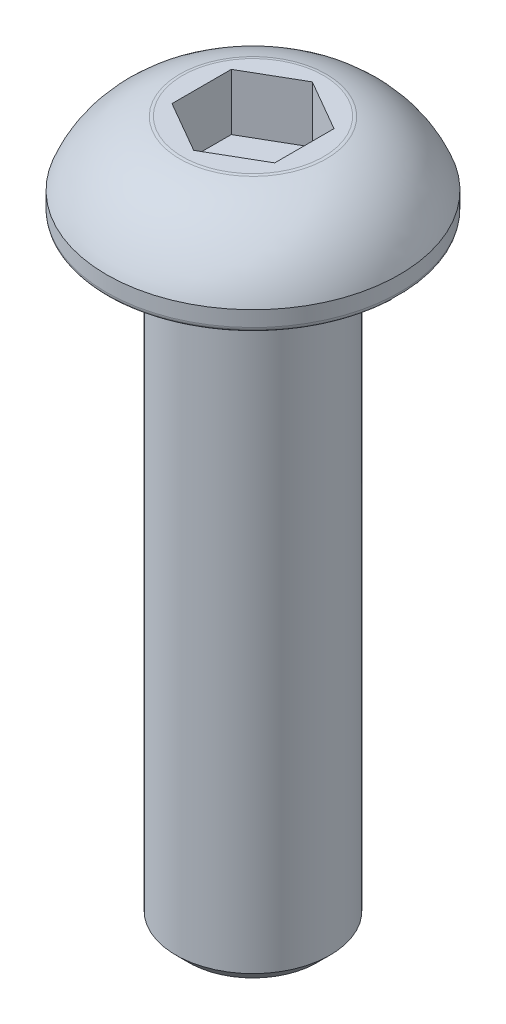
ISO-10303-21;
HEADER;
FILE_DESCRIPTION(('STEP AP214'),'2;1');
FILE_NAME('part.step','',(''),(''),'','','');
FILE_SCHEMA(('AUTOMOTIVE_DESIGN { 1 0 10303 214 1 1 1 1 }'));
ENDSEC;
DATA;
#1=APPLICATION_CONTEXT('core data for automotive mechanical design processes');
#2=APPLICATION_PROTOCOL_DEFINITION('international standard','automotive_design',2000,#1);
#3=PRODUCT_CONTEXT('',#1,'mechanical');
#4=PRODUCT('Part','Part','',(#3));
#5=PRODUCT_RELATED_PRODUCT_CATEGORY('part','',(#4));
#6=PRODUCT_DEFINITION_FORMATION('','',#4);
#7=PRODUCT_DEFINITION_CONTEXT('part definition',#1,'design');
#8=PRODUCT_DEFINITION('design','',#6,#7);
#9=PRODUCT_DEFINITION_SHAPE('','',#8);
#10=(LENGTH_UNIT() NAMED_UNIT(*) SI_UNIT(.MILLI.,.METRE.));
#11=(NAMED_UNIT(*) PLANE_ANGLE_UNIT() SI_UNIT($,.RADIAN.));
#12=(NAMED_UNIT(*) SI_UNIT($,.STERADIAN.) SOLID_ANGLE_UNIT());
#13=UNCERTAINTY_MEASURE_WITH_UNIT(LENGTH_MEASURE(1.E-05),#10,'distance_accuracy_value','');
#14=(GEOMETRIC_REPRESENTATION_CONTEXT(3) GLOBAL_UNCERTAINTY_ASSIGNED_CONTEXT((#13)) GLOBAL_UNIT_ASSIGNED_CONTEXT((#10,
#11,#12)) REPRESENTATION_CONTEXT('',''));
#15=CARTESIAN_POINT('',(0.,0.,0.));
#16=DIRECTION('',(0.,0.,1.));
#17=DIRECTION('',(1.,0.,0.));
#18=AXIS2_PLACEMENT_3D('',#15,#16,#17);
#19=CARTESIAN_POINT('',(0.,0.0999999999999998,0.));
#20=DIRECTION('',(0.,-1.,0.));
#21=DIRECTION('',(0.,0.,-1.));
#22=AXIS2_PLACEMENT_3D('',#19,#20,#21);
#23=TOROIDAL_SURFACE('',#22,2.75,0.0999999999999999);
#24=CARTESIAN_POINT('',(0.,0.,0.));
#25=DIRECTION('',(0.,-1.,0.));
#26=DIRECTION('',(0.,0.,-1.));
#27=AXIS2_PLACEMENT_3D('',#24,#25,#26);
#28=CIRCLE('',#27,2.75);
#29=CARTESIAN_POINT('',(0.,0.,-2.75));
#30=VERTEX_POINT('',#29);
#31=EDGE_CURVE('E136',#30,#30,#28,.T.);
#32=ORIENTED_EDGE('',*,*,#31,.F.);
#33=EDGE_LOOP('',(#32));
#34=FACE_BOUND('',#33,.T.);
#35=CARTESIAN_POINT('',(0.,0.100000000000001,0.));
#36=DIRECTION('',(0.,-1.,0.));
#37=DIRECTION('',(0.,0.,-1.));
#38=AXIS2_PLACEMENT_3D('',#35,#36,#37);
#39=CIRCLE('',#38,2.85);
#40=CARTESIAN_POINT('',(0.,0.100000000000001,-2.85));
#41=VERTEX_POINT('',#40);
#42=EDGE_CURVE('E11',#41,#41,#39,.T.);
#43=ORIENTED_EDGE('',*,*,#42,.T.);
#44=EDGE_LOOP('',(#43));
#45=FACE_BOUND('',#44,.T.);
#46=ADVANCED_FACE('F35',(#34,#45),#23,.T.);
#47=CARTESIAN_POINT('',(0.,-12.,0.));
#48=DIRECTION('',(0.,-1.,0.));
#49=DIRECTION('',(0.,0.,-1.));
#50=AXIS2_PLACEMENT_3D('',#47,#48,#49);
#51=CYLINDRICAL_SURFACE('',#50,2.85);
#52=ORIENTED_EDGE('',*,*,#42,.F.);
#53=EDGE_LOOP('',(#52));
#54=FACE_BOUND('',#53,.T.);
#55=CARTESIAN_POINT('',(0.,0.399999999999999,0.));
#56=DIRECTION('',(0.,-1.,0.));
#57=DIRECTION('',(0.,0.,-1.));
#58=AXIS2_PLACEMENT_3D('',#55,#56,#57);
#59=CIRCLE('',#58,2.85);
#60=CARTESIAN_POINT('',(0.,0.399999999999999,-2.85));
#61=VERTEX_POINT('',#60);
#62=EDGE_CURVE('E42',#61,#61,#59,.T.);
#63=ORIENTED_EDGE('',*,*,#62,.T.);
#64=EDGE_LOOP('',(#63));
#65=FACE_BOUND('',#64,.T.);
#66=ADVANCED_FACE('F164',(#54,#65),#51,.T.);
#67=CARTESIAN_POINT('',(0.,-0.305058043743636,0.));
#68=DIRECTION('',(0.,-1.,0.));
#69=DIRECTION('',(0.,0.,-1.));
#70=AXIS2_PLACEMENT_3D('',#67,#68,#69);
#71=DEGENERATE_TOROIDAL_SURFACE('',#70,0.978398238152038,2.,.T.);
#72=ORIENTED_EDGE('',*,*,#62,.F.);
#73=EDGE_LOOP('',(#72));
#74=FACE_BOUND('',#73,.T.);
#75=CARTESIAN_POINT('',(0.,1.6435797205348,0.));
#76=DIRECTION('',(0.,-1.,0.));
#77=DIRECTION('',(0.,0.,-1.));
#78=AXIS2_PLACEMENT_3D('',#75,#76,#77);
#79=CIRCLE('',#78,1.42874350972477);
#80=CARTESIAN_POINT('',(0.,1.6435797205348,-1.42874350972477));
#81=VERTEX_POINT('',#80);
#82=EDGE_CURVE('E159',#81,#81,#79,.T.);
#83=ORIENTED_EDGE('',*,*,#82,.T.);
#84=EDGE_LOOP('',(#83));
#85=FACE_BOUND('',#84,.T.);
#86=ADVANCED_FACE('F166',(#74,#85),#71,.T.);
#87=CARTESIAN_POINT('',(0.,1.4,0.));
#88=DIRECTION('',(0.,-1.,0.));
#89=DIRECTION('',(0.,0.,-1.));
#90=AXIS2_PLACEMENT_3D('',#87,#88,#89);
#91=TOROIDAL_SURFACE('',#90,1.37245035077818,0.25);
#92=ORIENTED_EDGE('',*,*,#82,.F.);
#93=EDGE_LOOP('',(#92));
#94=FACE_BOUND('',#93,.T.);
#95=CARTESIAN_POINT('',(0.,1.65,0.));
#96=DIRECTION('',(0.,-1.,0.));
#97=DIRECTION('',(0.,0.,-1.));
#98=AXIS2_PLACEMENT_3D('',#95,#96,#97);
#99=CIRCLE('',#98,1.37245035077818);
#100=CARTESIAN_POINT('',(0.,1.65,-1.37245035077818));
#101=VERTEX_POINT('',#100);
#102=EDGE_CURVE('E156',#101,#101,#99,.T.);
#103=ORIENTED_EDGE('',*,*,#102,.T.);
#104=EDGE_LOOP('',(#103));
#105=FACE_BOUND('',#104,.T.);
#106=ADVANCED_FACE('F169',(#94,#105),#91,.T.);
#107=CARTESIAN_POINT('',(-1.37245035077818,1.65,0.));
#108=DIRECTION('',(0.,-1.,0.));
#109=DIRECTION('',(0.,0.,-1.));
#110=AXIS2_PLACEMENT_3D('',#107,#108,#109);
#111=PLANE('',#110);
#112=DIRECTION('',(0.,0.,1.));
#113=VECTOR('',#112,1.);
#114=CARTESIAN_POINT('',(-1.,1.65,-0.577350269189625));
#115=LINE('',#114,#113);
#116=CARTESIAN_POINT('',(-1.,1.65,-0.577350269189625));
#117=VERTEX_POINT('',#116);
#118=CARTESIAN_POINT('',(-1.,1.65,0.577350269189626));
#119=VERTEX_POINT('',#118);
#120=EDGE_CURVE('E123',#117,#119,#115,.T.);
#121=ORIENTED_EDGE('',*,*,#120,.F.);
#122=DIRECTION('',(-0.866025403784438,0.,0.5));
#123=VECTOR('',#122,1.);
#124=CARTESIAN_POINT('',(0.,1.65,-1.15470053837925));
#125=LINE('',#124,#123);
#126=CARTESIAN_POINT('',(0.,1.65,-1.15470053837925));
#127=VERTEX_POINT('',#126);
#128=EDGE_CURVE('E49',#127,#117,#125,.T.);
#129=ORIENTED_EDGE('',*,*,#128,.F.);
#130=DIRECTION('',(-0.866025403784439,0.,-0.5));
#131=VECTOR('',#130,1.);
#132=CARTESIAN_POINT('',(1.,1.65,-0.577350269189626));
#133=LINE('',#132,#131);
#134=CARTESIAN_POINT('',(1.,1.65,-0.577350269189626));
#135=VERTEX_POINT('',#134);
#136=EDGE_CURVE('E132',#135,#127,#133,.T.);
#137=ORIENTED_EDGE('',*,*,#136,.F.);
#138=DIRECTION('',(0.,0.,-1.));
#139=VECTOR('',#138,1.);
#140=CARTESIAN_POINT('',(1.,1.65,0.577350269189625));
#141=LINE('',#140,#139);
#142=CARTESIAN_POINT('',(1.,1.65,0.577350269189625));
#143=VERTEX_POINT('',#142);
#144=EDGE_CURVE('E130',#143,#135,#141,.T.);
#145=ORIENTED_EDGE('',*,*,#144,.F.);
#146=DIRECTION('',(0.866025403784438,0.,-0.5));
#147=VECTOR('',#146,1.);
#148=CARTESIAN_POINT('',(0.,1.65,1.15470053837925));
#149=LINE('',#148,#147);
#150=CARTESIAN_POINT('',(0.,1.65,1.15470053837925));
#151=VERTEX_POINT('',#150);
#152=EDGE_CURVE('E97',#151,#143,#149,.T.);
#153=ORIENTED_EDGE('',*,*,#152,.F.);
#154=DIRECTION('',(0.866025403784439,0.,0.5));
#155=VECTOR('',#154,1.);
#156=CARTESIAN_POINT('',(-1.,1.65,0.577350269189626));
#157=LINE('',#156,#155);
#158=EDGE_CURVE('E126',#119,#151,#157,.T.);
#159=ORIENTED_EDGE('',*,*,#158,.F.);
#160=EDGE_LOOP('',(#121,#129,#137,#145,#153,#159));
#161=FACE_BOUND('',#160,.T.);
#162=ORIENTED_EDGE('',*,*,#102,.F.);
#163=EDGE_LOOP('',(#162));
#164=FACE_BOUND('',#163,.T.);
#165=ADVANCED_FACE('F175',(#161,#164),#111,.F.);
#166=CARTESIAN_POINT('',(-1.25,-12.,0.));
#167=DIRECTION('',(0.,1.,0.));
#168=DIRECTION('',(0.,0.,1.));
#169=AXIS2_PLACEMENT_3D('',#166,#167,#168);
#170=PLANE('',#169);
#171=CARTESIAN_POINT('',(0.,-12.,0.));
#172=DIRECTION('',(0.,-1.,0.));
#173=DIRECTION('',(0.,0.,-1.));
#174=AXIS2_PLACEMENT_3D('',#171,#172,#173);
#175=CIRCLE('',#174,1.25);
#176=CARTESIAN_POINT('',(0.,-12.,-1.25));
#177=VERTEX_POINT('',#176);
#178=EDGE_CURVE('E153',#177,#177,#175,.T.);
#179=ORIENTED_EDGE('',*,*,#178,.T.);
#180=EDGE_LOOP('',(#179));
#181=FACE_BOUND('',#180,.T.);
#182=ADVANCED_FACE('F180',(#181),#170,.F.);
#183=CARTESIAN_POINT('',(0.,-11.75,0.));
#184=DIRECTION('',(0.,1.,0.));
#185=DIRECTION('',(0.,0.,1.));
#186=AXIS2_PLACEMENT_3D('',#183,#184,#185);
#187=CONICAL_SURFACE('',#186,1.5,0.785398163397447);
#188=ORIENTED_EDGE('',*,*,#178,.F.);
#189=EDGE_LOOP('',(#188));
#190=FACE_BOUND('',#189,.T.);
#191=CARTESIAN_POINT('',(0.,-11.75,0.));
#192=DIRECTION('',(0.,-1.,0.));
#193=DIRECTION('',(0.,0.,-1.));
#194=AXIS2_PLACEMENT_3D('',#191,#192,#193);
#195=CIRCLE('',#194,1.5);
#196=CARTESIAN_POINT('',(0.,-11.75,-1.5));
#197=VERTEX_POINT('',#196);
#198=EDGE_CURVE('E150',#197,#197,#195,.T.);
#199=ORIENTED_EDGE('',*,*,#198,.T.);
#200=EDGE_LOOP('',(#199));
#201=FACE_BOUND('',#200,.T.);
#202=ADVANCED_FACE('F186',(#190,#201),#187,.T.);
#203=CARTESIAN_POINT('',(0.,-12.,0.));
#204=DIRECTION('',(0.,-1.,0.));
#205=DIRECTION('',(0.,0.,-1.));
#206=AXIS2_PLACEMENT_3D('',#203,#204,#205);
#207=CYLINDRICAL_SURFACE('',#206,1.5);
#208=ORIENTED_EDGE('',*,*,#198,.F.);
#209=EDGE_LOOP('',(#208));
#210=FACE_BOUND('',#209,.T.);
#211=CARTESIAN_POINT('',(0.,-0.100000000000001,0.));
#212=DIRECTION('',(0.,-1.,0.));
#213=DIRECTION('',(0.,0.,-1.));
#214=AXIS2_PLACEMENT_3D('',#211,#212,#213);
#215=CIRCLE('',#214,1.5);
#216=CARTESIAN_POINT('',(0.,-0.100000000000001,-1.5));
#217=VERTEX_POINT('',#216);
#218=EDGE_CURVE('E147',#217,#217,#215,.T.);
#219=ORIENTED_EDGE('',*,*,#218,.T.);
#220=EDGE_LOOP('',(#219));
#221=FACE_BOUND('',#220,.T.);
#222=ADVANCED_FACE('F212',(#210,#221),#207,.T.);
#223=CARTESIAN_POINT('',(0.,-0.1,0.));
#224=DIRECTION('',(0.,-1.,0.));
#225=DIRECTION('',(0.,0.,-1.));
#226=AXIS2_PLACEMENT_3D('',#223,#224,#225);
#227=TOROIDAL_SURFACE('',#226,1.6,0.1);
#228=ORIENTED_EDGE('',*,*,#218,.F.);
#229=EDGE_LOOP('',(#228));
#230=FACE_BOUND('',#229,.T.);
#231=CARTESIAN_POINT('',(0.,0.,0.));
#232=DIRECTION('',(0.,-1.,0.));
#233=DIRECTION('',(0.,0.,-1.));
#234=AXIS2_PLACEMENT_3D('',#231,#232,#233);
#235=CIRCLE('',#234,1.6);
#236=CARTESIAN_POINT('',(0.,0.,-1.6));
#237=VERTEX_POINT('',#236);
#238=EDGE_CURVE('E144',#237,#237,#235,.T.);
#239=ORIENTED_EDGE('',*,*,#238,.T.);
#240=EDGE_LOOP('',(#239));
#241=FACE_BOUND('',#240,.T.);
#242=ADVANCED_FACE('F203',(#230,#241),#227,.F.);
#243=CARTESIAN_POINT('',(-1.6,0.,0.));
#244=DIRECTION('',(0.,1.,0.));
#245=DIRECTION('',(0.,0.,1.));
#246=AXIS2_PLACEMENT_3D('',#243,#244,#245);
#247=PLANE('',#246);
#248=ORIENTED_EDGE('',*,*,#238,.F.);
#249=EDGE_LOOP('',(#248));
#250=FACE_BOUND('',#249,.T.);
#251=ORIENTED_EDGE('',*,*,#31,.T.);
#252=EDGE_LOOP('',(#251));
#253=FACE_BOUND('',#252,.T.);
#254=ADVANCED_FACE('F200',(#250,#253),#247,.F.);
#255=CARTESIAN_POINT('',(0.,0.55,-1.15470053837925));
#256=DIRECTION('',(-0.5,0.,-0.866025403784438));
#257=DIRECTION('',(-0.866025403784438,0.,0.5));
#258=AXIS2_PLACEMENT_3D('',#255,#256,#257);
#259=PLANE('',#258);
#260=ORIENTED_EDGE('',*,*,#128,.T.);
#261=DIRECTION('',(0.,1.,0.));
#262=VECTOR('',#261,1.);
#263=CARTESIAN_POINT('',(-1.,0.55,-0.577350269189625));
#264=LINE('',#263,#262);
#265=CARTESIAN_POINT('',(-1.,0.55,-0.577350269189625));
#266=VERTEX_POINT('',#265);
#267=EDGE_CURVE('E79',#266,#117,#264,.T.);
#268=ORIENTED_EDGE('',*,*,#267,.F.);
#269=DIRECTION('',(-0.866025403784438,0.,0.5));
#270=VECTOR('',#269,1.);
#271=CARTESIAN_POINT('',(0.,0.55,-1.15470053837925));
#272=LINE('',#271,#270);
#273=CARTESIAN_POINT('',(0.,0.55,-1.15470053837925));
#274=VERTEX_POINT('',#273);
#275=EDGE_CURVE('E134',#274,#266,#272,.T.);
#276=ORIENTED_EDGE('',*,*,#275,.F.);
#277=DIRECTION('',(0.,1.,0.));
#278=VECTOR('',#277,1.);
#279=CARTESIAN_POINT('',(0.,0.55,-1.15470053837925));
#280=LINE('',#279,#278);
#281=EDGE_CURVE('E57',#274,#127,#280,.T.);
#282=ORIENTED_EDGE('',*,*,#281,.T.);
#283=EDGE_LOOP('',(#260,#268,#276,#282));
#284=FACE_BOUND('',#283,.T.);
#285=ADVANCED_FACE('F202',(#284),#259,.F.);
#286=CARTESIAN_POINT('',(1.,0.55,-0.577350269189626));
#287=DIRECTION('',(0.5,0.,-0.866025403784439));
#288=DIRECTION('',(-0.866025403784439,0.,-0.5));
#289=AXIS2_PLACEMENT_3D('',#286,#287,#288);
#290=PLANE('',#289);
#291=ORIENTED_EDGE('',*,*,#136,.T.);
#292=ORIENTED_EDGE('',*,*,#281,.F.);
#293=DIRECTION('',(-0.866025403784439,0.,-0.5));
#294=VECTOR('',#293,1.);
#295=CARTESIAN_POINT('',(1.,0.55,-0.577350269189626));
#296=LINE('',#295,#294);
#297=CARTESIAN_POINT('',(1.,0.55,-0.577350269189626));
#298=VERTEX_POINT('',#297);
#299=EDGE_CURVE('E109',#298,#274,#296,.T.);
#300=ORIENTED_EDGE('',*,*,#299,.F.);
#301=DIRECTION('',(0.,1.,0.));
#302=VECTOR('',#301,1.);
#303=CARTESIAN_POINT('',(1.,0.55,-0.577350269189626));
#304=LINE('',#303,#302);
#305=EDGE_CURVE('E101',#298,#135,#304,.T.);
#306=ORIENTED_EDGE('',*,*,#305,.T.);
#307=EDGE_LOOP('',(#291,#292,#300,#306));
#308=FACE_BOUND('',#307,.T.);
#309=ADVANCED_FACE('F210',(#308),#290,.F.);
#310=CARTESIAN_POINT('',(1.,0.55,0.577350269189625));
#311=DIRECTION('',(1.,0.,0.));
#312=DIRECTION('',(0.,0.,-1.));
#313=AXIS2_PLACEMENT_3D('',#310,#311,#312);
#314=PLANE('',#313);
#315=ORIENTED_EDGE('',*,*,#144,.T.);
#316=ORIENTED_EDGE('',*,*,#305,.F.);
#317=DIRECTION('',(0.,0.,-1.));
#318=VECTOR('',#317,1.);
#319=CARTESIAN_POINT('',(1.,0.55,0.577350269189625));
#320=LINE('',#319,#318);
#321=CARTESIAN_POINT('',(1.,0.55,0.577350269189625));
#322=VERTEX_POINT('',#321);
#323=EDGE_CURVE('E105',#322,#298,#320,.T.);
#324=ORIENTED_EDGE('',*,*,#323,.F.);
#325=DIRECTION('',(0.,1.,0.));
#326=VECTOR('',#325,1.);
#327=CARTESIAN_POINT('',(1.,0.55,0.577350269189625));
#328=LINE('',#327,#326);
#329=EDGE_CURVE('E90',#322,#143,#328,.T.);
#330=ORIENTED_EDGE('',*,*,#329,.T.);
#331=EDGE_LOOP('',(#315,#316,#324,#330));
#332=FACE_BOUND('',#331,.T.);
#333=ADVANCED_FACE('F106',(#332),#314,.F.);
#334=CARTESIAN_POINT('',(0.,0.55,1.15470053837925));
#335=DIRECTION('',(0.5,0.,0.866025403784438));
#336=DIRECTION('',(0.866025403784438,0.,-0.5));
#337=AXIS2_PLACEMENT_3D('',#334,#335,#336);
#338=PLANE('',#337);
#339=ORIENTED_EDGE('',*,*,#152,.T.);
#340=ORIENTED_EDGE('',*,*,#329,.F.);
#341=DIRECTION('',(0.866025403784438,0.,-0.5));
#342=VECTOR('',#341,1.);
#343=CARTESIAN_POINT('',(0.,0.55,1.15470053837925));
#344=LINE('',#343,#342);
#345=CARTESIAN_POINT('',(0.,0.55,1.15470053837925));
#346=VERTEX_POINT('',#345);
#347=EDGE_CURVE('E94',#346,#322,#344,.T.);
#348=ORIENTED_EDGE('',*,*,#347,.F.);
#349=DIRECTION('',(0.,1.,0.));
#350=VECTOR('',#349,1.);
#351=CARTESIAN_POINT('',(0.,0.55,1.15470053837925));
#352=LINE('',#351,#350);
#353=EDGE_CURVE('E102',#346,#151,#352,.T.);
#354=ORIENTED_EDGE('',*,*,#353,.T.);
#355=EDGE_LOOP('',(#339,#340,#348,#354));
#356=FACE_BOUND('',#355,.T.);
#357=ADVANCED_FACE('F92',(#356),#338,.F.);
#358=CARTESIAN_POINT('',(-1.,0.55,0.577350269189626));
#359=DIRECTION('',(-0.5,0.,0.866025403784438));
#360=DIRECTION('',(0.866025403784439,0.,0.5));
#361=AXIS2_PLACEMENT_3D('',#358,#359,#360);
#362=PLANE('',#361);
#363=ORIENTED_EDGE('',*,*,#158,.T.);
#364=ORIENTED_EDGE('',*,*,#353,.F.);
#365=DIRECTION('',(0.866025403784439,0.,0.5));
#366=VECTOR('',#365,1.);
#367=CARTESIAN_POINT('',(-1.,0.55,0.577350269189626));
#368=LINE('',#367,#366);
#369=CARTESIAN_POINT('',(-1.,0.55,0.577350269189626));
#370=VERTEX_POINT('',#369);
#371=EDGE_CURVE('E115',#370,#346,#368,.T.);
#372=ORIENTED_EDGE('',*,*,#371,.F.);
#373=DIRECTION('',(0.,1.,0.));
#374=VECTOR('',#373,1.);
#375=CARTESIAN_POINT('',(-1.,0.55,0.577350269189626));
#376=LINE('',#375,#374);
#377=EDGE_CURVE('E139',#370,#119,#376,.T.);
#378=ORIENTED_EDGE('',*,*,#377,.T.);
#379=EDGE_LOOP('',(#363,#364,#372,#378));
#380=FACE_BOUND('',#379,.T.);
#381=ADVANCED_FACE('F282',(#380),#362,.F.);
#382=CARTESIAN_POINT('',(-1.,0.55,-0.577350269189625));
#383=DIRECTION('',(-1.,0.,0.));
#384=DIRECTION('',(0.,0.,1.));
#385=AXIS2_PLACEMENT_3D('',#382,#383,#384);
#386=PLANE('',#385);
#387=ORIENTED_EDGE('',*,*,#120,.T.);
#388=ORIENTED_EDGE('',*,*,#377,.F.);
#389=DIRECTION('',(0.,0.,1.));
#390=VECTOR('',#389,1.);
#391=CARTESIAN_POINT('',(-1.,0.55,-0.577350269189625));
#392=LINE('',#391,#390);
#393=EDGE_CURVE('E117',#266,#370,#392,.T.);
#394=ORIENTED_EDGE('',*,*,#393,.F.);
#395=ORIENTED_EDGE('',*,*,#267,.T.);
#396=EDGE_LOOP('',(#387,#388,#394,#395));
#397=FACE_BOUND('',#396,.T.);
#398=ADVANCED_FACE('F291',(#397),#386,.F.);
#399=CARTESIAN_POINT('',(0.,0.55,0.));
#400=DIRECTION('',(0.,1.,0.));
#401=DIRECTION('',(0.,0.,1.));
#402=AXIS2_PLACEMENT_3D('',#399,#400,#401);
#403=PLANE('',#402);
#404=ORIENTED_EDGE('',*,*,#275,.T.);
#405=ORIENTED_EDGE('',*,*,#393,.T.);
#406=ORIENTED_EDGE('',*,*,#371,.T.);
#407=ORIENTED_EDGE('',*,*,#347,.T.);
#408=ORIENTED_EDGE('',*,*,#323,.T.);
#409=ORIENTED_EDGE('',*,*,#299,.T.);
#410=EDGE_LOOP('',(#404,#405,#406,#407,#408,#409));
#411=FACE_BOUND('',#410,.T.);
#412=ADVANCED_FACE('F112',(#411),#403,.T.);
#413=CLOSED_SHELL('',(#46,#66,#86,#106,#165,#182,#202,#222,#242,#254,#285,#309,#333,#357,#381,
#398,#412));
#414=MANIFOLD_SOLID_BREP('B2',#413);
#415=ADVANCED_BREP_SHAPE_REPRESENTATION('',(#18,#414),#14);
#416=SHAPE_DEFINITION_REPRESENTATION(#9,#415);
ENDSEC;
END-ISO-10303-21;
